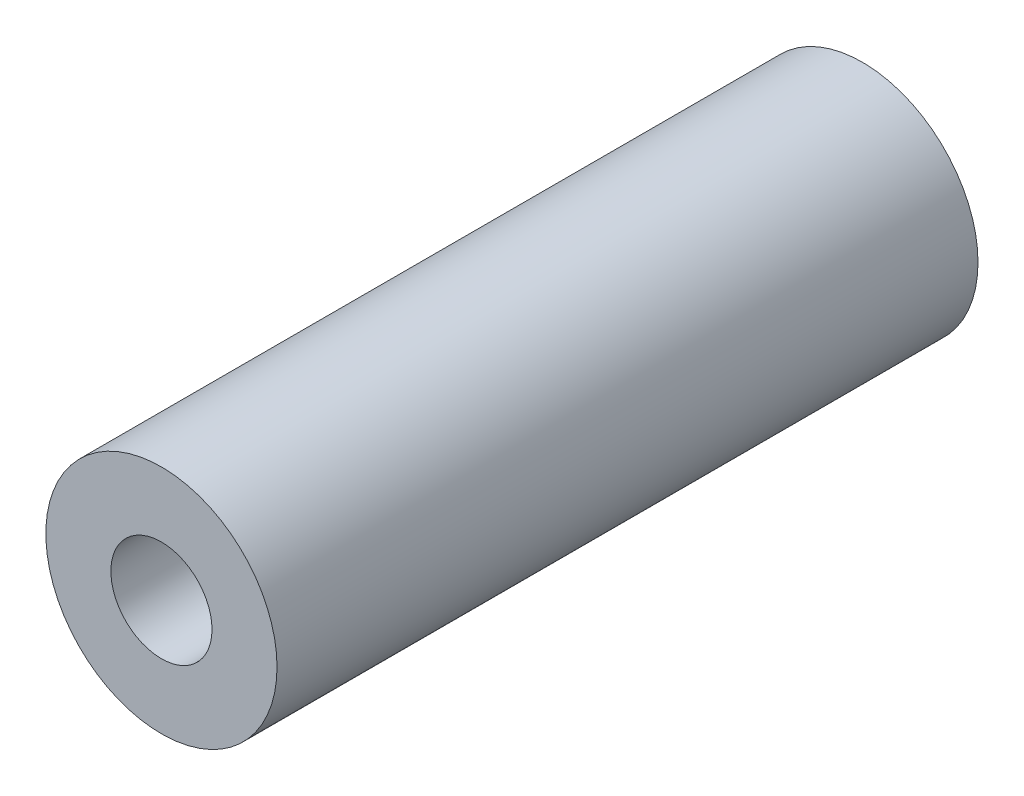
ISO-10303-21;
HEADER;
FILE_DESCRIPTION(('STEP AP214'),'2;1');
FILE_NAME('part.step','',(''),(''),'','','');
FILE_SCHEMA(('AUTOMOTIVE_DESIGN { 1 0 10303 214 1 1 1 1 }'));
ENDSEC;
DATA;
#1=APPLICATION_CONTEXT('core data for automotive mechanical design processes');
#2=APPLICATION_PROTOCOL_DEFINITION('international standard','automotive_design',2000,#1);
#3=PRODUCT_CONTEXT('',#1,'mechanical');
#4=PRODUCT('Part','Part','',(#3));
#5=PRODUCT_RELATED_PRODUCT_CATEGORY('part','',(#4));
#6=PRODUCT_DEFINITION_FORMATION('','',#4);
#7=PRODUCT_DEFINITION_CONTEXT('part definition',#1,'design');
#8=PRODUCT_DEFINITION('design','',#6,#7);
#9=PRODUCT_DEFINITION_SHAPE('','',#8);
#10=(LENGTH_UNIT() NAMED_UNIT(*) SI_UNIT(.MILLI.,.METRE.));
#11=(NAMED_UNIT(*) PLANE_ANGLE_UNIT() SI_UNIT($,.RADIAN.));
#12=(NAMED_UNIT(*) SI_UNIT($,.STERADIAN.) SOLID_ANGLE_UNIT());
#13=UNCERTAINTY_MEASURE_WITH_UNIT(LENGTH_MEASURE(1.E-05),#10,'distance_accuracy_value','');
#14=(GEOMETRIC_REPRESENTATION_CONTEXT(3) GLOBAL_UNCERTAINTY_ASSIGNED_CONTEXT((#13)) GLOBAL_UNIT_ASSIGNED_CONTEXT((#10,
#11,#12)) REPRESENTATION_CONTEXT('',''));
#15=CARTESIAN_POINT('',(0.,0.,0.));
#16=DIRECTION('',(0.,0.,1.));
#17=DIRECTION('',(1.,0.,0.));
#18=AXIS2_PLACEMENT_3D('',#15,#16,#17);
#19=CARTESIAN_POINT('',(0.,0.,48.514));
#20=DIRECTION('',(0.,0.,1.));
#21=DIRECTION('',(1.,0.,0.));
#22=AXIS2_PLACEMENT_3D('',#19,#20,#21);
#23=PLANE('',#22);
#24=CARTESIAN_POINT('',(0.,0.,48.514));
#25=DIRECTION('',(0.,0.,1.));
#26=DIRECTION('',(1.,0.,0.));
#27=AXIS2_PLACEMENT_3D('',#24,#25,#26);
#28=CIRCLE('',#27,8.);
#29=CARTESIAN_POINT('',(8.,0.,48.514));
#30=VERTEX_POINT('',#29);
#31=EDGE_CURVE('E10',#30,#30,#28,.T.);
#32=ORIENTED_EDGE('',*,*,#31,.T.);
#33=EDGE_LOOP('',(#32));
#34=FACE_BOUND('',#33,.T.);
#35=CARTESIAN_POINT('',(0.,0.,48.514));
#36=DIRECTION('',(0.,0.,1.));
#37=DIRECTION('',(1.,0.,0.));
#38=AXIS2_PLACEMENT_3D('',#35,#36,#37);
#39=CIRCLE('',#38,3.5);
#40=CARTESIAN_POINT('',(3.5,0.,48.514));
#41=VERTEX_POINT('',#40);
#42=EDGE_CURVE('E50',#41,#41,#39,.T.);
#43=ORIENTED_EDGE('',*,*,#42,.F.);
#44=EDGE_LOOP('',(#43));
#45=FACE_BOUND('',#44,.T.);
#46=ADVANCED_FACE('F37',(#34,#45),#23,.T.);
#47=CARTESIAN_POINT('',(0.,0.,0.));
#48=DIRECTION('',(0.,0.,1.));
#49=DIRECTION('',(1.,0.,0.));
#50=AXIS2_PLACEMENT_3D('',#47,#48,#49);
#51=PLANE('',#50);
#52=CARTESIAN_POINT('',(0.,0.,0.));
#53=DIRECTION('',(0.,0.,1.));
#54=DIRECTION('',(1.,0.,0.));
#55=AXIS2_PLACEMENT_3D('',#52,#53,#54);
#56=CIRCLE('',#55,8.);
#57=CARTESIAN_POINT('',(8.,0.,0.));
#58=VERTEX_POINT('',#57);
#59=EDGE_CURVE('E41',#58,#58,#56,.T.);
#60=ORIENTED_EDGE('',*,*,#59,.F.);
#61=EDGE_LOOP('',(#60));
#62=FACE_BOUND('',#61,.T.);
#63=CARTESIAN_POINT('',(0.,0.,0.));
#64=DIRECTION('',(0.,0.,1.));
#65=DIRECTION('',(1.,0.,0.));
#66=AXIS2_PLACEMENT_3D('',#63,#64,#65);
#67=CIRCLE('',#66,3.5);
#68=CARTESIAN_POINT('',(3.5,0.,0.));
#69=VERTEX_POINT('',#68);
#70=EDGE_CURVE('E52',#69,#69,#67,.T.);
#71=ORIENTED_EDGE('',*,*,#70,.T.);
#72=EDGE_LOOP('',(#71));
#73=FACE_BOUND('',#72,.T.);
#74=ADVANCED_FACE('F64',(#62,#73),#51,.F.);
#75=CARTESIAN_POINT('',(0.,0.,48.514));
#76=DIRECTION('',(0.,0.,-1.));
#77=DIRECTION('',(-1.,0.,0.));
#78=AXIS2_PLACEMENT_3D('',#75,#76,#77);
#79=CYLINDRICAL_SURFACE('',#78,8.);
#80=ORIENTED_EDGE('',*,*,#31,.F.);
#81=EDGE_LOOP('',(#80));
#82=FACE_BOUND('',#81,.T.);
#83=ORIENTED_EDGE('',*,*,#59,.T.);
#84=EDGE_LOOP('',(#83));
#85=FACE_BOUND('',#84,.T.);
#86=ADVANCED_FACE('F39',(#82,#85),#79,.T.);
#87=CARTESIAN_POINT('',(0.,0.,48.514));
#88=DIRECTION('',(0.,0.,-1.));
#89=DIRECTION('',(-1.,0.,0.));
#90=AXIS2_PLACEMENT_3D('',#87,#88,#89);
#91=CYLINDRICAL_SURFACE('',#90,3.5);
#92=ORIENTED_EDGE('',*,*,#42,.T.);
#93=EDGE_LOOP('',(#92));
#94=FACE_BOUND('',#93,.T.);
#95=ORIENTED_EDGE('',*,*,#70,.F.);
#96=EDGE_LOOP('',(#95));
#97=FACE_BOUND('',#96,.T.);
#98=ADVANCED_FACE('F60',(#94,#97),#91,.F.);
#99=CLOSED_SHELL('',(#46,#74,#86,#98));
#100=MANIFOLD_SOLID_BREP('B2',#99);
#101=ADVANCED_BREP_SHAPE_REPRESENTATION('',(#18,#100),#14);
#102=SHAPE_DEFINITION_REPRESENTATION(#9,#101);
ENDSEC;
END-ISO-10303-21;
